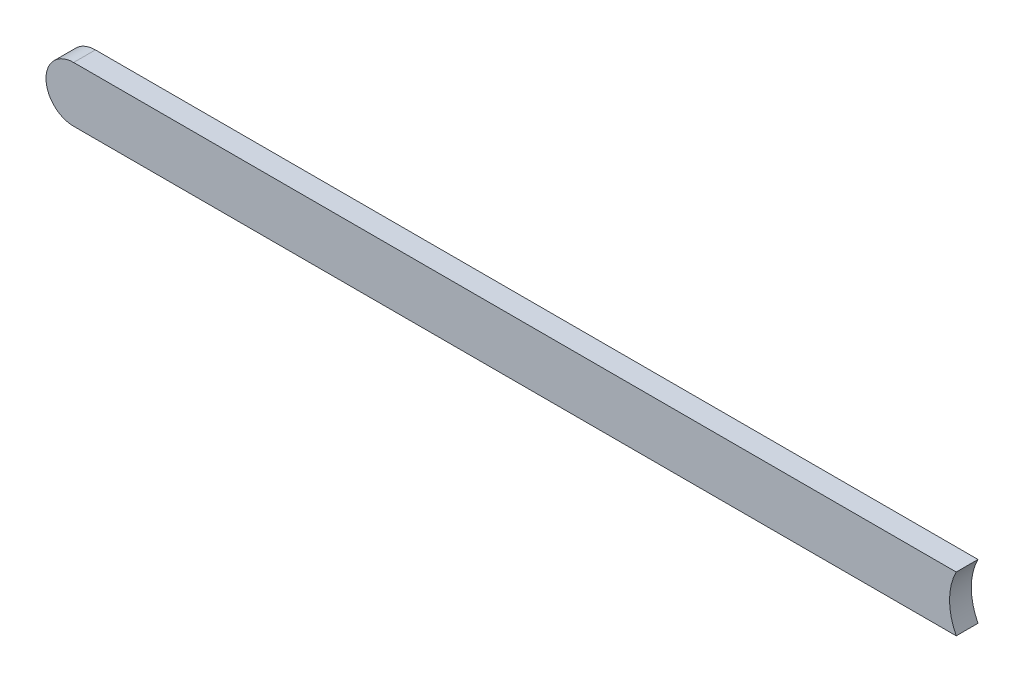
ISO-10303-21;
HEADER;
FILE_DESCRIPTION(('STEP AP214'),'2;1');
FILE_NAME('part.step','',(''),(''),'','','');
FILE_SCHEMA(('AUTOMOTIVE_DESIGN { 1 0 10303 214 1 1 1 1 }'));
ENDSEC;
DATA;
#1=APPLICATION_CONTEXT('core data for automotive mechanical design processes');
#2=APPLICATION_PROTOCOL_DEFINITION('international standard','automotive_design',2000,#1);
#3=PRODUCT_CONTEXT('',#1,'mechanical');
#4=PRODUCT('Part','Part','',(#3));
#5=PRODUCT_RELATED_PRODUCT_CATEGORY('part','',(#4));
#6=PRODUCT_DEFINITION_FORMATION('','',#4);
#7=PRODUCT_DEFINITION_CONTEXT('part definition',#1,'design');
#8=PRODUCT_DEFINITION('design','',#6,#7);
#9=PRODUCT_DEFINITION_SHAPE('','',#8);
#10=(LENGTH_UNIT() NAMED_UNIT(*) SI_UNIT(.MILLI.,.METRE.));
#11=(NAMED_UNIT(*) PLANE_ANGLE_UNIT() SI_UNIT($,.RADIAN.));
#12=(NAMED_UNIT(*) SI_UNIT($,.STERADIAN.) SOLID_ANGLE_UNIT());
#13=UNCERTAINTY_MEASURE_WITH_UNIT(LENGTH_MEASURE(1.E-05),#10,'distance_accuracy_value','');
#14=(GEOMETRIC_REPRESENTATION_CONTEXT(3) GLOBAL_UNCERTAINTY_ASSIGNED_CONTEXT((#13)) GLOBAL_UNIT_ASSIGNED_CONTEXT((#10,
#11,#12)) REPRESENTATION_CONTEXT('',''));
#15=CARTESIAN_POINT('',(0.,0.,0.));
#16=DIRECTION('',(0.,0.,1.));
#17=DIRECTION('',(1.,0.,0.));
#18=AXIS2_PLACEMENT_3D('',#15,#16,#17);
#19=CARTESIAN_POINT('',(120.4214,103.505,0.));
#20=DIRECTION('',(0.,1.,0.));
#21=DIRECTION('',(1.,0.,0.));
#22=AXIS2_PLACEMENT_3D('',#19,#20,#21);
#23=PLANE('',#22);
#24=DIRECTION('',(1.,0.,0.));
#25=VECTOR('',#24,1.);
#26=CARTESIAN_POINT('',(120.4214,103.505,0.1999996));
#27=LINE('',#26,#25);
#28=CARTESIAN_POINT('',(120.4214,103.505,0.1999996));
#29=VERTEX_POINT('',#28);
#30=CARTESIAN_POINT('',(128.531269109142,103.505,0.1999996));
#31=VERTEX_POINT('',#30);
#32=EDGE_CURVE('E11',#29,#31,#27,.T.);
#33=ORIENTED_EDGE('',*,*,#32,.F.);
#34=DIRECTION('',(0.,0.,1.));
#35=VECTOR('',#34,1.);
#36=CARTESIAN_POINT('',(120.4214,103.505,0.));
#37=LINE('',#36,#35);
#38=CARTESIAN_POINT('',(120.4214,103.505,0.));
#39=VERTEX_POINT('',#38);
#40=EDGE_CURVE('E24',#39,#29,#37,.T.);
#41=ORIENTED_EDGE('',*,*,#40,.F.);
#42=DIRECTION('',(1.,0.,0.));
#43=VECTOR('',#42,1.);
#44=CARTESIAN_POINT('',(120.4214,103.505,0.));
#45=LINE('',#44,#43);
#46=CARTESIAN_POINT('',(128.531269109142,103.505,0.));
#47=VERTEX_POINT('',#46);
#48=EDGE_CURVE('E75',#39,#47,#45,.T.);
#49=ORIENTED_EDGE('',*,*,#48,.T.);
#50=DIRECTION('',(0.,0.,1.));
#51=VECTOR('',#50,1.);
#52=CARTESIAN_POINT('',(128.531269109142,103.505,0.));
#53=LINE('',#52,#51);
#54=EDGE_CURVE('E37',#47,#31,#53,.T.);
#55=ORIENTED_EDGE('',*,*,#54,.T.);
#56=EDGE_LOOP('',(#33,#41,#49,#55));
#57=FACE_BOUND('',#56,.T.);
#58=ADVANCED_FACE('F17',(#57),#23,.F.);
#59=CARTESIAN_POINT('',(129.0247356,103.759,0.));
#60=DIRECTION('',(0.,0.,-1.));
#61=DIRECTION('',(1.,0.,0.));
#62=AXIS2_PLACEMENT_3D('',#59,#60,#61);
#63=CYLINDRICAL_SURFACE('',#62,0.55500016);
#64=DIRECTION('',(0.,0.,1.));
#65=VECTOR('',#64,1.);
#66=CARTESIAN_POINT('',(128.531269109142,104.013,0.));
#67=LINE('',#66,#65);
#68=CARTESIAN_POINT('',(128.531269109142,104.013,0.));
#69=VERTEX_POINT('',#68);
#70=CARTESIAN_POINT('',(128.531269109142,104.013,0.1999996));
#71=VERTEX_POINT('',#70);
#72=EDGE_CURVE('E67',#69,#71,#67,.T.);
#73=ORIENTED_EDGE('',*,*,#72,.T.);
#74=CARTESIAN_POINT('',(129.0247356,103.759,0.1999996));
#75=DIRECTION('',(0.,0.,1.));
#76=DIRECTION('',(1.,0.,0.));
#77=AXIS2_PLACEMENT_3D('',#74,#75,#76);
#78=CIRCLE('',#77,0.55500016);
#79=EDGE_CURVE('E82',#71,#31,#78,.T.);
#80=ORIENTED_EDGE('',*,*,#79,.T.);
#81=ORIENTED_EDGE('',*,*,#54,.F.);
#82=CARTESIAN_POINT('',(129.0247356,103.759,0.));
#83=DIRECTION('',(0.,0.,1.));
#84=DIRECTION('',(1.,0.,0.));
#85=AXIS2_PLACEMENT_3D('',#82,#83,#84);
#86=CIRCLE('',#85,0.55500016);
#87=EDGE_CURVE('E80',#69,#47,#86,.T.);
#88=ORIENTED_EDGE('',*,*,#87,.F.);
#89=EDGE_LOOP('',(#73,#80,#81,#88));
#90=FACE_BOUND('',#89,.T.);
#91=ADVANCED_FACE('F88',(#90),#63,.F.);
#92=CARTESIAN_POINT('',(128.531269109142,104.013,0.));
#93=DIRECTION('',(0.,-1.,0.));
#94=DIRECTION('',(-1.,0.,0.));
#95=AXIS2_PLACEMENT_3D('',#92,#93,#94);
#96=PLANE('',#95);
#97=DIRECTION('',(-1.,0.,0.));
#98=VECTOR('',#97,1.);
#99=CARTESIAN_POINT('',(129.0247356,104.013,0.1999996));
#100=LINE('',#99,#98);
#101=CARTESIAN_POINT('',(120.4214,104.013,0.1999996));
#102=VERTEX_POINT('',#101);
#103=EDGE_CURVE('E71',#71,#102,#100,.T.);
#104=ORIENTED_EDGE('',*,*,#103,.F.);
#105=ORIENTED_EDGE('',*,*,#72,.F.);
#106=DIRECTION('',(-1.,0.,0.));
#107=VECTOR('',#106,1.);
#108=CARTESIAN_POINT('',(129.0247356,104.013,0.));
#109=LINE('',#108,#107);
#110=CARTESIAN_POINT('',(120.4214,104.013,0.));
#111=VERTEX_POINT('',#110);
#112=EDGE_CURVE('E63',#69,#111,#109,.T.);
#113=ORIENTED_EDGE('',*,*,#112,.T.);
#114=DIRECTION('',(0.,0.,1.));
#115=VECTOR('',#114,1.);
#116=CARTESIAN_POINT('',(120.4214,104.013,0.));
#117=LINE('',#116,#115);
#118=EDGE_CURVE('E53',#111,#102,#117,.T.);
#119=ORIENTED_EDGE('',*,*,#118,.T.);
#120=EDGE_LOOP('',(#104,#105,#113,#119));
#121=FACE_BOUND('',#120,.T.);
#122=ADVANCED_FACE('F66',(#121),#96,.F.);
#123=CARTESIAN_POINT('',(120.4214,103.759,0.));
#124=DIRECTION('',(0.,0.,-1.));
#125=DIRECTION('',(0.,1.,0.));
#126=AXIS2_PLACEMENT_3D('',#123,#124,#125);
#127=CYLINDRICAL_SURFACE('',#126,0.254);
#128=CARTESIAN_POINT('',(120.4214,103.759,0.1999996));
#129=DIRECTION('',(0.,0.,1.));
#130=DIRECTION('',(0.,1.,0.));
#131=AXIS2_PLACEMENT_3D('',#128,#129,#130);
#132=CIRCLE('',#131,0.254);
#133=EDGE_CURVE('E59',#102,#29,#132,.T.);
#134=ORIENTED_EDGE('',*,*,#133,.F.);
#135=ORIENTED_EDGE('',*,*,#118,.F.);
#136=CARTESIAN_POINT('',(120.4214,103.759,0.));
#137=DIRECTION('',(0.,0.,1.));
#138=DIRECTION('',(0.,1.,0.));
#139=AXIS2_PLACEMENT_3D('',#136,#137,#138);
#140=CIRCLE('',#139,0.254);
#141=EDGE_CURVE('E57',#111,#39,#140,.T.);
#142=ORIENTED_EDGE('',*,*,#141,.T.);
#143=ORIENTED_EDGE('',*,*,#40,.T.);
#144=EDGE_LOOP('',(#134,#135,#142,#143));
#145=FACE_BOUND('',#144,.T.);
#146=ADVANCED_FACE('F55',(#145),#127,.T.);
#147=CARTESIAN_POINT('',(120.4214,103.505,0.));
#148=DIRECTION('',(0.,0.,-1.));
#149=DIRECTION('',(-1.,0.,0.));
#150=AXIS2_PLACEMENT_3D('',#147,#148,#149);
#151=PLANE('',#150);
#152=ORIENTED_EDGE('',*,*,#48,.F.);
#153=ORIENTED_EDGE('',*,*,#141,.F.);
#154=ORIENTED_EDGE('',*,*,#112,.F.);
#155=ORIENTED_EDGE('',*,*,#87,.T.);
#156=EDGE_LOOP('',(#152,#153,#154,#155));
#157=FACE_BOUND('',#156,.T.);
#158=ADVANCED_FACE('F74',(#157),#151,.T.);
#159=CARTESIAN_POINT('',(120.4214,103.505,0.1999996));
#160=DIRECTION('',(0.,0.,-1.));
#161=DIRECTION('',(-1.,0.,0.));
#162=AXIS2_PLACEMENT_3D('',#159,#160,#161);
#163=PLANE('',#162);
#164=ORIENTED_EDGE('',*,*,#133,.T.);
#165=ORIENTED_EDGE('',*,*,#32,.T.);
#166=ORIENTED_EDGE('',*,*,#79,.F.);
#167=ORIENTED_EDGE('',*,*,#103,.T.);
#168=EDGE_LOOP('',(#164,#165,#166,#167));
#169=FACE_BOUND('',#168,.T.);
#170=ADVANCED_FACE('F91',(#169),#163,.F.);
#171=CLOSED_SHELL('',(#58,#91,#122,#146,#158,#170));
#172=MANIFOLD_SOLID_BREP('B1',#171);
#173=ADVANCED_BREP_SHAPE_REPRESENTATION('',(#18,#172),#14);
#174=SHAPE_DEFINITION_REPRESENTATION(#9,#173);
ENDSEC;
END-ISO-10303-21;
